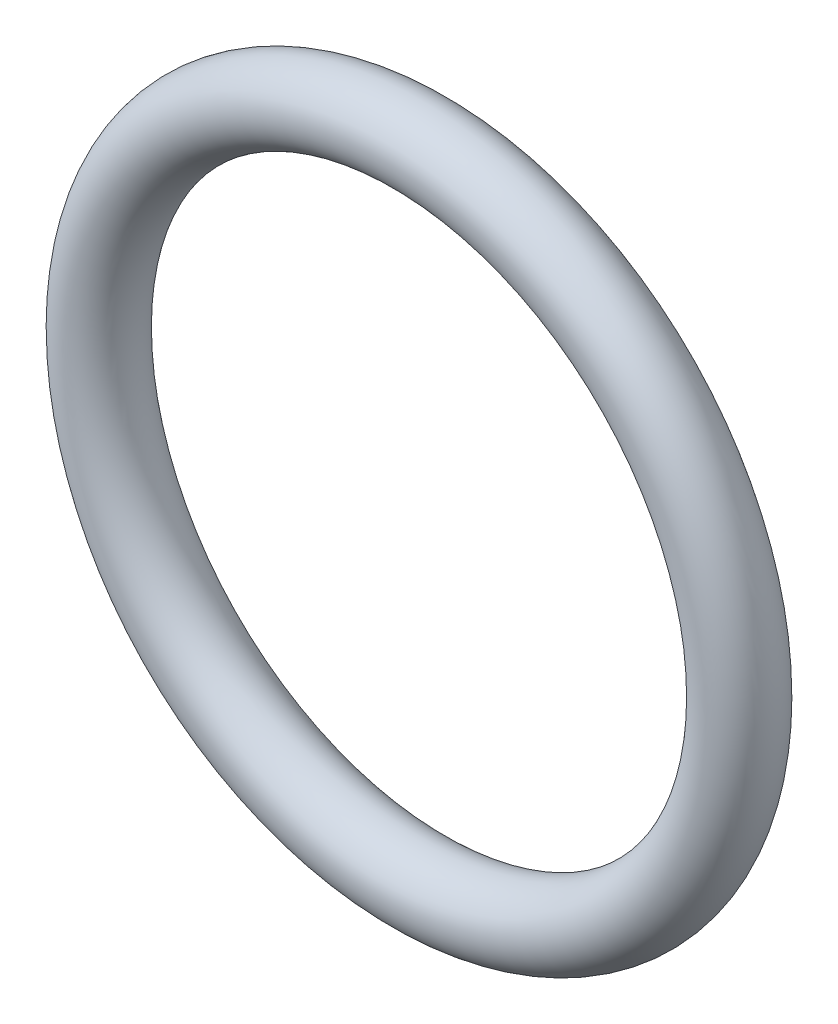
ISO-10303-21;
HEADER;
FILE_DESCRIPTION(('STEP AP214'),'2;1');
FILE_NAME('part.step','',(''),(''),'','','');
FILE_SCHEMA(('AUTOMOTIVE_DESIGN { 1 0 10303 214 1 1 1 1 }'));
ENDSEC;
DATA;
#1=APPLICATION_CONTEXT('core data for automotive mechanical design processes');
#2=APPLICATION_PROTOCOL_DEFINITION('international standard','automotive_design',2000,#1);
#3=PRODUCT_CONTEXT('',#1,'mechanical');
#4=PRODUCT('Part','Part','',(#3));
#5=PRODUCT_RELATED_PRODUCT_CATEGORY('part','',(#4));
#6=PRODUCT_DEFINITION_FORMATION('','',#4);
#7=PRODUCT_DEFINITION_CONTEXT('part definition',#1,'design');
#8=PRODUCT_DEFINITION('design','',#6,#7);
#9=PRODUCT_DEFINITION_SHAPE('','',#8);
#10=(LENGTH_UNIT() NAMED_UNIT(*) SI_UNIT(.MILLI.,.METRE.));
#11=(NAMED_UNIT(*) PLANE_ANGLE_UNIT() SI_UNIT($,.RADIAN.));
#12=(NAMED_UNIT(*) SI_UNIT($,.STERADIAN.) SOLID_ANGLE_UNIT());
#13=UNCERTAINTY_MEASURE_WITH_UNIT(LENGTH_MEASURE(1.E-05),#10,'distance_accuracy_value','');
#14=(GEOMETRIC_REPRESENTATION_CONTEXT(3) GLOBAL_UNCERTAINTY_ASSIGNED_CONTEXT((#13)) GLOBAL_UNIT_ASSIGNED_CONTEXT((#10,
#11,#12)) REPRESENTATION_CONTEXT('',''));
#15=CARTESIAN_POINT('',(0.,0.,0.));
#16=DIRECTION('',(0.,0.,1.));
#17=DIRECTION('',(1.,0.,0.));
#18=AXIS2_PLACEMENT_3D('',#15,#16,#17);
#19=CARTESIAN_POINT('',(0.,0.,0.));
#20=DIRECTION('',(0.,0.,1.));
#21=DIRECTION('',(1.,0.,0.));
#22=AXIS2_PLACEMENT_3D('',#19,#20,#21);
#23=TOROIDAL_SURFACE('',#22,10.75,1.25);
#24=CARTESIAN_POINT('',(12.,0.,0.));
#25=VERTEX_POINT('',#24);
#26=VERTEX_LOOP('',#25);
#27=FACE_BOUND('',#26,.T.);
#28=ADVANCED_FACE('F38',(#27),#23,.T.);
#29=CLOSED_SHELL('',(#28));
#30=MANIFOLD_SOLID_BREP('B2',#29);
#31=ADVANCED_BREP_SHAPE_REPRESENTATION('',(#18,#30),#14);
#32=SHAPE_DEFINITION_REPRESENTATION(#9,#31);
ENDSEC;
END-ISO-10303-21;
